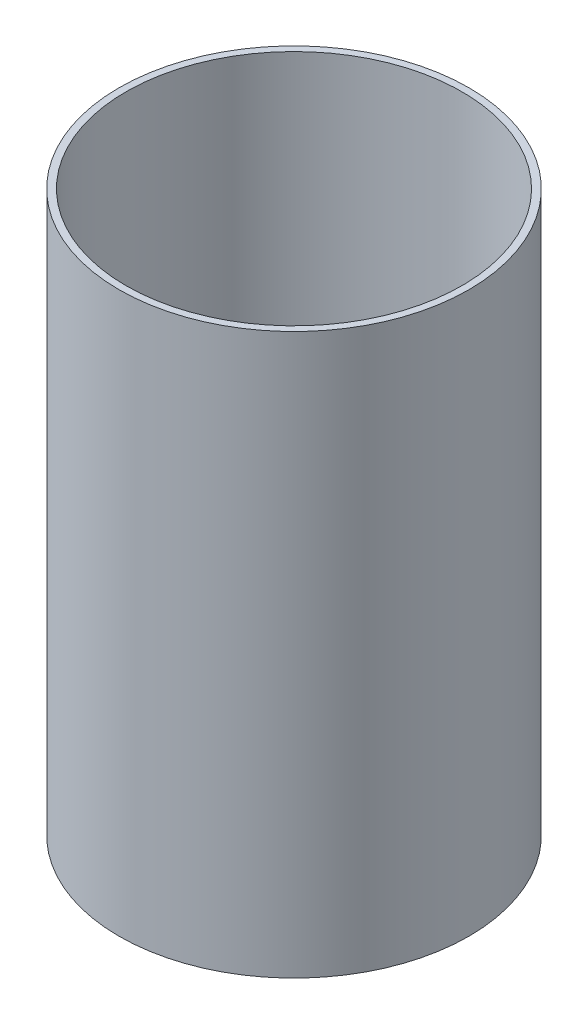
ISO-10303-21;
HEADER;
FILE_DESCRIPTION(('STEP AP214'),'2;1');
FILE_NAME('part.step','',(''),(''),'','','');
FILE_SCHEMA(('AUTOMOTIVE_DESIGN { 1 0 10303 214 1 1 1 1 }'));
ENDSEC;
DATA;
#1=APPLICATION_CONTEXT('core data for automotive mechanical design processes');
#2=APPLICATION_PROTOCOL_DEFINITION('international standard','automotive_design',2000,#1);
#3=PRODUCT_CONTEXT('',#1,'mechanical');
#4=PRODUCT('Part','Part','',(#3));
#5=PRODUCT_RELATED_PRODUCT_CATEGORY('part','',(#4));
#6=PRODUCT_DEFINITION_FORMATION('','',#4);
#7=PRODUCT_DEFINITION_CONTEXT('part definition',#1,'design');
#8=PRODUCT_DEFINITION('design','',#6,#7);
#9=PRODUCT_DEFINITION_SHAPE('','',#8);
#10=(LENGTH_UNIT() NAMED_UNIT(*) SI_UNIT(.MILLI.,.METRE.));
#11=(NAMED_UNIT(*) PLANE_ANGLE_UNIT() SI_UNIT($,.RADIAN.));
#12=(NAMED_UNIT(*) SI_UNIT($,.STERADIAN.) SOLID_ANGLE_UNIT());
#13=UNCERTAINTY_MEASURE_WITH_UNIT(LENGTH_MEASURE(1.E-05),#10,'distance_accuracy_value','');
#14=(GEOMETRIC_REPRESENTATION_CONTEXT(3) GLOBAL_UNCERTAINTY_ASSIGNED_CONTEXT((#13)) GLOBAL_UNIT_ASSIGNED_CONTEXT((#10,
#11,#12)) REPRESENTATION_CONTEXT('',''));
#15=CARTESIAN_POINT('',(0.,0.,0.));
#16=DIRECTION('',(0.,0.,1.));
#17=DIRECTION('',(1.,0.,0.));
#18=AXIS2_PLACEMENT_3D('',#15,#16,#17);
#19=CARTESIAN_POINT('',(0.,63.5,0.));
#20=DIRECTION('',(0.,1.,0.));
#21=DIRECTION('',(0.,0.,1.));
#22=AXIS2_PLACEMENT_3D('',#19,#20,#21);
#23=PLANE('',#22);
#24=CARTESIAN_POINT('',(0.,63.5,0.));
#25=DIRECTION('',(0.,1.,0.));
#26=DIRECTION('',(0.,0.,1.));
#27=AXIS2_PLACEMENT_3D('',#24,#25,#26);
#28=CIRCLE('',#27,39.6748);
#29=CARTESIAN_POINT('',(0.,63.5,39.6748));
#30=VERTEX_POINT('',#29);
#31=EDGE_CURVE('E10',#30,#30,#28,.T.);
#32=ORIENTED_EDGE('',*,*,#31,.T.);
#33=EDGE_LOOP('',(#32));
#34=FACE_BOUND('',#33,.T.);
#35=CARTESIAN_POINT('',(0.,63.5,0.));
#36=DIRECTION('',(0.,1.,0.));
#37=DIRECTION('',(0.,0.,1.));
#38=AXIS2_PLACEMENT_3D('',#35,#36,#37);
#39=CIRCLE('',#38,38.1);
#40=CARTESIAN_POINT('',(0.,63.5,38.1));
#41=VERTEX_POINT('',#40);
#42=EDGE_CURVE('E45',#41,#41,#39,.T.);
#43=ORIENTED_EDGE('',*,*,#42,.F.);
#44=EDGE_LOOP('',(#43));
#45=FACE_BOUND('',#44,.T.);
#46=ADVANCED_FACE('F34',(#34,#45),#23,.T.);
#47=CARTESIAN_POINT('',(0.,-63.5,0.));
#48=DIRECTION('',(0.,1.,0.));
#49=DIRECTION('',(0.,0.,1.));
#50=AXIS2_PLACEMENT_3D('',#47,#48,#49);
#51=PLANE('',#50);
#52=CARTESIAN_POINT('',(0.,-63.5,0.));
#53=DIRECTION('',(0.,1.,0.));
#54=DIRECTION('',(0.,0.,1.));
#55=AXIS2_PLACEMENT_3D('',#52,#53,#54);
#56=CIRCLE('',#55,39.6748);
#57=CARTESIAN_POINT('',(0.,-63.5,39.6748));
#58=VERTEX_POINT('',#57);
#59=EDGE_CURVE('E38',#58,#58,#56,.T.);
#60=ORIENTED_EDGE('',*,*,#59,.F.);
#61=EDGE_LOOP('',(#60));
#62=FACE_BOUND('',#61,.T.);
#63=CARTESIAN_POINT('',(0.,-63.5,0.));
#64=DIRECTION('',(0.,1.,0.));
#65=DIRECTION('',(0.,0.,1.));
#66=AXIS2_PLACEMENT_3D('',#63,#64,#65);
#67=CIRCLE('',#66,38.1);
#68=CARTESIAN_POINT('',(0.,-63.5,38.1));
#69=VERTEX_POINT('',#68);
#70=EDGE_CURVE('E47',#69,#69,#67,.T.);
#71=ORIENTED_EDGE('',*,*,#70,.T.);
#72=EDGE_LOOP('',(#71));
#73=FACE_BOUND('',#72,.T.);
#74=ADVANCED_FACE('F57',(#62,#73),#51,.F.);
#75=CARTESIAN_POINT('',(0.,63.5,0.));
#76=DIRECTION('',(0.,-1.,0.));
#77=DIRECTION('',(0.,0.,-1.));
#78=AXIS2_PLACEMENT_3D('',#75,#76,#77);
#79=CYLINDRICAL_SURFACE('',#78,39.6748);
#80=ORIENTED_EDGE('',*,*,#31,.F.);
#81=EDGE_LOOP('',(#80));
#82=FACE_BOUND('',#81,.T.);
#83=ORIENTED_EDGE('',*,*,#59,.T.);
#84=EDGE_LOOP('',(#83));
#85=FACE_BOUND('',#84,.T.);
#86=ADVANCED_FACE('F36',(#82,#85),#79,.T.);
#87=CARTESIAN_POINT('',(0.,63.5,0.));
#88=DIRECTION('',(0.,-1.,0.));
#89=DIRECTION('',(0.,0.,-1.));
#90=AXIS2_PLACEMENT_3D('',#87,#88,#89);
#91=CYLINDRICAL_SURFACE('',#90,38.1);
#92=ORIENTED_EDGE('',*,*,#42,.T.);
#93=EDGE_LOOP('',(#92));
#94=FACE_BOUND('',#93,.T.);
#95=ORIENTED_EDGE('',*,*,#70,.F.);
#96=EDGE_LOOP('',(#95));
#97=FACE_BOUND('',#96,.T.);
#98=ADVANCED_FACE('F53',(#94,#97),#91,.F.);
#99=CLOSED_SHELL('',(#46,#74,#86,#98));
#100=MANIFOLD_SOLID_BREP('B2',#99);
#101=ADVANCED_BREP_SHAPE_REPRESENTATION('',(#18,#100),#14);
#102=SHAPE_DEFINITION_REPRESENTATION(#9,#101);
ENDSEC;
END-ISO-10303-21;
